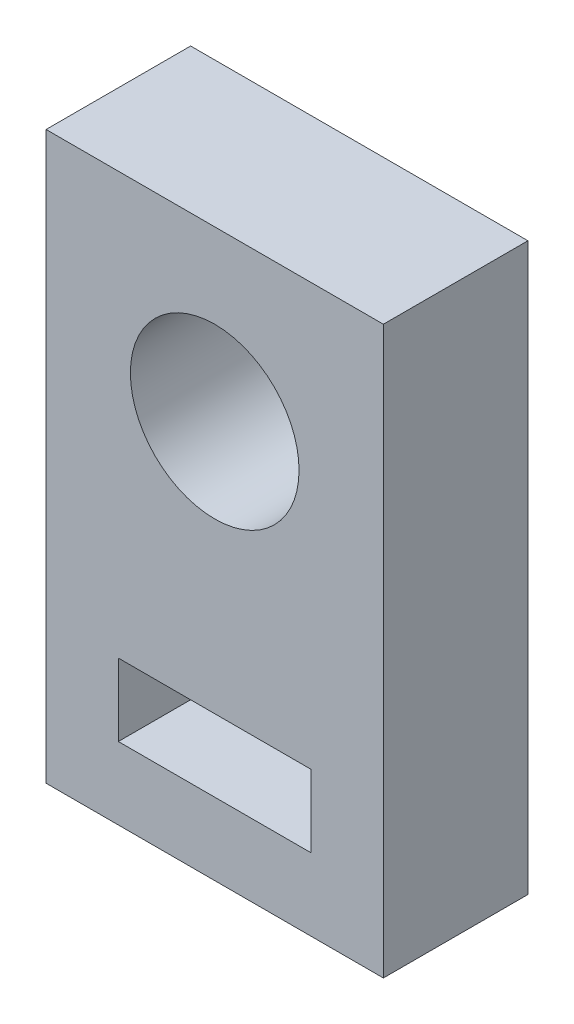
ISO-10303-21;
HEADER;
FILE_DESCRIPTION(('STEP AP214'),'2;1');
FILE_NAME('part.step','',(''),(''),'','','');
FILE_SCHEMA(('AUTOMOTIVE_DESIGN { 1 0 10303 214 1 1 1 1 }'));
ENDSEC;
DATA;
#1=APPLICATION_CONTEXT('core data for automotive mechanical design processes');
#2=APPLICATION_PROTOCOL_DEFINITION('international standard','automotive_design',2000,#1);
#3=PRODUCT_CONTEXT('',#1,'mechanical');
#4=PRODUCT('Part','Part','',(#3));
#5=PRODUCT_RELATED_PRODUCT_CATEGORY('part','',(#4));
#6=PRODUCT_DEFINITION_FORMATION('','',#4);
#7=PRODUCT_DEFINITION_CONTEXT('part definition',#1,'design');
#8=PRODUCT_DEFINITION('design','',#6,#7);
#9=PRODUCT_DEFINITION_SHAPE('','',#8);
#10=(LENGTH_UNIT() NAMED_UNIT(*) SI_UNIT(.MILLI.,.METRE.));
#11=(NAMED_UNIT(*) PLANE_ANGLE_UNIT() SI_UNIT($,.RADIAN.));
#12=(NAMED_UNIT(*) SI_UNIT($,.STERADIAN.) SOLID_ANGLE_UNIT());
#13=UNCERTAINTY_MEASURE_WITH_UNIT(LENGTH_MEASURE(1.E-05),#10,'distance_accuracy_value','');
#14=(GEOMETRIC_REPRESENTATION_CONTEXT(3) GLOBAL_UNCERTAINTY_ASSIGNED_CONTEXT((#13)) GLOBAL_UNIT_ASSIGNED_CONTEXT((#10,
#11,#12)) REPRESENTATION_CONTEXT('',''));
#15=CARTESIAN_POINT('',(0.,0.,0.));
#16=DIRECTION('',(0.,0.,1.));
#17=DIRECTION('',(1.,0.,0.));
#18=AXIS2_PLACEMENT_3D('',#15,#16,#17);
#19=CARTESIAN_POINT('',(0.,-7.96436240136799,6.));
#20=DIRECTION('',(0.,1.,0.));
#21=DIRECTION('',(0.,0.,1.));
#22=AXIS2_PLACEMENT_3D('',#19,#20,#21);
#23=PLANE('',#22);
#24=DIRECTION('',(1.,0.,0.));
#25=VECTOR('',#24,1.);
#26=CARTESIAN_POINT('',(0.,-7.96436240136799,0.));
#27=LINE('',#26,#25);
#28=CARTESIAN_POINT('',(-6.84808447260447,-7.96436240136799,0.));
#29=VERTEX_POINT('',#28);
#30=CARTESIAN_POINT('',(7.15191552739555,-7.96436240136799,0.));
#31=VERTEX_POINT('',#30);
#32=EDGE_CURVE('E146',#29,#31,#27,.T.);
#33=ORIENTED_EDGE('',*,*,#32,.T.);
#34=DIRECTION('',(0.,0.,-1.));
#35=VECTOR('',#34,1.);
#36=CARTESIAN_POINT('',(7.15191552739555,-7.96436240136799,6.));
#37=LINE('',#36,#35);
#38=CARTESIAN_POINT('',(7.15191552739555,-7.96436240136799,6.));
#39=VERTEX_POINT('',#38);
#40=EDGE_CURVE('E11',#39,#31,#37,.T.);
#41=ORIENTED_EDGE('',*,*,#40,.F.);
#42=DIRECTION('',(1.,0.,0.));
#43=VECTOR('',#42,1.);
#44=CARTESIAN_POINT('',(0.,-7.96436240136799,6.));
#45=LINE('',#44,#43);
#46=CARTESIAN_POINT('',(-6.84808447260447,-7.96436240136799,6.));
#47=VERTEX_POINT('',#46);
#48=EDGE_CURVE('E114',#47,#39,#45,.T.);
#49=ORIENTED_EDGE('',*,*,#48,.F.);
#50=DIRECTION('',(0.,0.,-1.));
#51=VECTOR('',#50,1.);
#52=CARTESIAN_POINT('',(-6.84808447260447,-7.96436240136799,6.));
#53=LINE('',#52,#51);
#54=EDGE_CURVE('E54',#47,#29,#53,.T.);
#55=ORIENTED_EDGE('',*,*,#54,.T.);
#56=EDGE_LOOP('',(#33,#41,#49,#55));
#57=FACE_BOUND('',#56,.T.);
#58=ADVANCED_FACE('F35',(#57),#23,.F.);
#59=CARTESIAN_POINT('',(7.15191552739554,0.,6.));
#60=DIRECTION('',(-1.,0.,0.));
#61=DIRECTION('',(0.,-1.,0.));
#62=AXIS2_PLACEMENT_3D('',#59,#60,#61);
#63=PLANE('',#62);
#64=DIRECTION('',(0.,1.,0.));
#65=VECTOR('',#64,1.);
#66=CARTESIAN_POINT('',(7.15191552739554,0.,0.));
#67=LINE('',#66,#65);
#68=CARTESIAN_POINT('',(7.15191552739554,15.535637598632,0.));
#69=VERTEX_POINT('',#68);
#70=EDGE_CURVE('E120',#31,#69,#67,.T.);
#71=ORIENTED_EDGE('',*,*,#70,.T.);
#72=DIRECTION('',(0.,0.,-1.));
#73=VECTOR('',#72,1.);
#74=CARTESIAN_POINT('',(7.15191552739554,15.535637598632,6.));
#75=LINE('',#74,#73);
#76=CARTESIAN_POINT('',(7.15191552739554,15.535637598632,6.));
#77=VERTEX_POINT('',#76);
#78=EDGE_CURVE('E45',#77,#69,#75,.T.);
#79=ORIENTED_EDGE('',*,*,#78,.F.);
#80=DIRECTION('',(0.,1.,0.));
#81=VECTOR('',#80,1.);
#82=CARTESIAN_POINT('',(7.15191552739554,0.,6.));
#83=LINE('',#82,#81);
#84=EDGE_CURVE('E108',#39,#77,#83,.T.);
#85=ORIENTED_EDGE('',*,*,#84,.F.);
#86=ORIENTED_EDGE('',*,*,#40,.T.);
#87=EDGE_LOOP('',(#71,#79,#85,#86));
#88=FACE_BOUND('',#87,.T.);
#89=ADVANCED_FACE('F119',(#88),#63,.F.);
#90=CARTESIAN_POINT('',(0.,15.535637598632,6.));
#91=DIRECTION('',(0.,1.,0.));
#92=DIRECTION('',(-1.,0.,0.));
#93=AXIS2_PLACEMENT_3D('',#90,#91,#92);
#94=PLANE('',#93);
#95=DIRECTION('',(1.,0.,0.));
#96=VECTOR('',#95,1.);
#97=CARTESIAN_POINT('',(0.,15.535637598632,0.));
#98=LINE('',#97,#96);
#99=CARTESIAN_POINT('',(-6.84808447260447,15.535637598632,0.));
#100=VERTEX_POINT('',#99);
#101=EDGE_CURVE('E149',#100,#69,#98,.T.);
#102=ORIENTED_EDGE('',*,*,#101,.F.);
#103=DIRECTION('',(0.,0.,-1.));
#104=VECTOR('',#103,1.);
#105=CARTESIAN_POINT('',(-6.84808447260447,15.535637598632,6.));
#106=LINE('',#105,#104);
#107=CARTESIAN_POINT('',(-6.84808447260447,15.535637598632,6.));
#108=VERTEX_POINT('',#107);
#109=EDGE_CURVE('E80',#108,#100,#106,.T.);
#110=ORIENTED_EDGE('',*,*,#109,.F.);
#111=DIRECTION('',(1.,0.,0.));
#112=VECTOR('',#111,1.);
#113=CARTESIAN_POINT('',(0.,15.535637598632,6.));
#114=LINE('',#113,#112);
#115=EDGE_CURVE('E113',#108,#77,#114,.T.);
#116=ORIENTED_EDGE('',*,*,#115,.T.);
#117=ORIENTED_EDGE('',*,*,#78,.T.);
#118=EDGE_LOOP('',(#102,#110,#116,#117));
#119=FACE_BOUND('',#118,.T.);
#120=ADVANCED_FACE('F124',(#119),#94,.T.);
#121=CARTESIAN_POINT('',(4.15191552739554,0.,6.));
#122=DIRECTION('',(-1.,0.,0.));
#123=DIRECTION('',(0.,-1.,0.));
#124=AXIS2_PLACEMENT_3D('',#121,#122,#123);
#125=PLANE('',#124);
#126=DIRECTION('',(0.,1.,0.));
#127=VECTOR('',#126,1.);
#128=CARTESIAN_POINT('',(4.15191552739554,0.,0.));
#129=LINE('',#128,#127);
#130=CARTESIAN_POINT('',(4.15191552739554,-4.96436240136799,0.));
#131=VERTEX_POINT('',#130);
#132=CARTESIAN_POINT('',(4.15191552739554,-1.96436240136799,0.));
#133=VERTEX_POINT('',#132);
#134=EDGE_CURVE('E134',#131,#133,#129,.T.);
#135=ORIENTED_EDGE('',*,*,#134,.F.);
#136=DIRECTION('',(0.,0.,-1.));
#137=VECTOR('',#136,1.);
#138=CARTESIAN_POINT('',(4.15191552739554,-4.96436240136799,6.));
#139=LINE('',#138,#137);
#140=CARTESIAN_POINT('',(4.15191552739554,-4.96436240136799,6.));
#141=VERTEX_POINT('',#140);
#142=EDGE_CURVE('E39',#141,#131,#139,.T.);
#143=ORIENTED_EDGE('',*,*,#142,.F.);
#144=DIRECTION('',(0.,1.,0.));
#145=VECTOR('',#144,1.);
#146=CARTESIAN_POINT('',(4.15191552739554,0.,6.));
#147=LINE('',#146,#145);
#148=CARTESIAN_POINT('',(4.15191552739554,-1.96436240136799,6.));
#149=VERTEX_POINT('',#148);
#150=EDGE_CURVE('E185',#141,#149,#147,.T.);
#151=ORIENTED_EDGE('',*,*,#150,.T.);
#152=DIRECTION('',(0.,0.,-1.));
#153=VECTOR('',#152,1.);
#154=CARTESIAN_POINT('',(4.15191552739554,-1.96436240136799,6.));
#155=LINE('',#154,#153);
#156=EDGE_CURVE('E127',#149,#133,#155,.T.);
#157=ORIENTED_EDGE('',*,*,#156,.T.);
#158=EDGE_LOOP('',(#135,#143,#151,#157));
#159=FACE_BOUND('',#158,.T.);
#160=ADVANCED_FACE('F170',(#159),#125,.T.);
#161=CARTESIAN_POINT('',(0.,-4.96436240136799,6.));
#162=DIRECTION('',(0.,1.,0.));
#163=DIRECTION('',(-1.,0.,0.));
#164=AXIS2_PLACEMENT_3D('',#161,#162,#163);
#165=PLANE('',#164);
#166=DIRECTION('',(1.,0.,0.));
#167=VECTOR('',#166,1.);
#168=CARTESIAN_POINT('',(0.,-4.96436240136799,0.));
#169=LINE('',#168,#167);
#170=CARTESIAN_POINT('',(-3.84808447260446,-4.96436240136799,0.));
#171=VERTEX_POINT('',#170);
#172=EDGE_CURVE('E137',#171,#131,#169,.T.);
#173=ORIENTED_EDGE('',*,*,#172,.F.);
#174=DIRECTION('',(0.,0.,-1.));
#175=VECTOR('',#174,1.);
#176=CARTESIAN_POINT('',(-3.84808447260446,-4.96436240136799,6.));
#177=LINE('',#176,#175);
#178=CARTESIAN_POINT('',(-3.84808447260446,-4.96436240136799,6.));
#179=VERTEX_POINT('',#178);
#180=EDGE_CURVE('E160',#179,#171,#177,.T.);
#181=ORIENTED_EDGE('',*,*,#180,.F.);
#182=DIRECTION('',(1.,0.,0.));
#183=VECTOR('',#182,1.);
#184=CARTESIAN_POINT('',(0.,-4.96436240136799,6.));
#185=LINE('',#184,#183);
#186=EDGE_CURVE('E169',#179,#141,#185,.T.);
#187=ORIENTED_EDGE('',*,*,#186,.T.);
#188=ORIENTED_EDGE('',*,*,#142,.T.);
#189=EDGE_LOOP('',(#173,#181,#187,#188));
#190=FACE_BOUND('',#189,.T.);
#191=ADVANCED_FACE('F167',(#190),#165,.T.);
#192=CARTESIAN_POINT('',(-3.84808447260446,0.,6.));
#193=DIRECTION('',(-1.,0.,0.));
#194=DIRECTION('',(0.,0.,1.));
#195=AXIS2_PLACEMENT_3D('',#192,#193,#194);
#196=PLANE('',#195);
#197=DIRECTION('',(0.,1.,0.));
#198=VECTOR('',#197,1.);
#199=CARTESIAN_POINT('',(-3.84808447260446,0.,0.));
#200=LINE('',#199,#198);
#201=CARTESIAN_POINT('',(-3.84808447260446,-1.96436240136799,0.));
#202=VERTEX_POINT('',#201);
#203=EDGE_CURVE('E140',#171,#202,#200,.T.);
#204=ORIENTED_EDGE('',*,*,#203,.T.);
#205=DIRECTION('',(0.,0.,-1.));
#206=VECTOR('',#205,1.);
#207=CARTESIAN_POINT('',(-3.84808447260446,-1.96436240136799,6.));
#208=LINE('',#207,#206);
#209=CARTESIAN_POINT('',(-3.84808447260446,-1.96436240136799,6.));
#210=VERTEX_POINT('',#209);
#211=EDGE_CURVE('E158',#210,#202,#208,.T.);
#212=ORIENTED_EDGE('',*,*,#211,.F.);
#213=DIRECTION('',(0.,1.,0.));
#214=VECTOR('',#213,1.);
#215=CARTESIAN_POINT('',(-3.84808447260446,0.,6.));
#216=LINE('',#215,#214);
#217=EDGE_CURVE('E178',#179,#210,#216,.T.);
#218=ORIENTED_EDGE('',*,*,#217,.F.);
#219=ORIENTED_EDGE('',*,*,#180,.T.);
#220=EDGE_LOOP('',(#204,#212,#218,#219));
#221=FACE_BOUND('',#220,.T.);
#222=ADVANCED_FACE('F176',(#221),#196,.F.);
#223=CARTESIAN_POINT('',(0.,-1.96436240136799,6.));
#224=DIRECTION('',(0.,1.,0.));
#225=DIRECTION('',(-1.,0.,0.));
#226=AXIS2_PLACEMENT_3D('',#223,#224,#225);
#227=PLANE('',#226);
#228=DIRECTION('',(1.,0.,0.));
#229=VECTOR('',#228,1.);
#230=CARTESIAN_POINT('',(0.,-1.96436240136799,0.));
#231=LINE('',#230,#229);
#232=EDGE_CURVE('E143',#202,#133,#231,.T.);
#233=ORIENTED_EDGE('',*,*,#232,.T.);
#234=ORIENTED_EDGE('',*,*,#156,.F.);
#235=DIRECTION('',(1.,0.,0.));
#236=VECTOR('',#235,1.);
#237=CARTESIAN_POINT('',(0.,-1.96436240136799,6.));
#238=LINE('',#237,#236);
#239=EDGE_CURVE('E181',#210,#149,#238,.T.);
#240=ORIENTED_EDGE('',*,*,#239,.F.);
#241=ORIENTED_EDGE('',*,*,#211,.T.);
#242=EDGE_LOOP('',(#233,#234,#240,#241));
#243=FACE_BOUND('',#242,.T.);
#244=ADVANCED_FACE('F180',(#243),#227,.F.);
#245=CARTESIAN_POINT('',(0.151915527395555,8.53563759863201,6.));
#246=DIRECTION('',(0.,0.,-1.));
#247=DIRECTION('',(-1.,0.,0.));
#248=AXIS2_PLACEMENT_3D('',#245,#246,#247);
#249=CYLINDRICAL_SURFACE('',#248,3.5);
#250=CARTESIAN_POINT('',(0.151915527395555,8.53563759863201,6.));
#251=DIRECTION('',(0.,0.,1.));
#252=DIRECTION('',(1.,0.,0.));
#253=AXIS2_PLACEMENT_3D('',#250,#251,#252);
#254=CIRCLE('',#253,3.5);
#255=CARTESIAN_POINT('',(3.65191552739555,8.53563759863201,6.));
#256=VERTEX_POINT('',#255);
#257=EDGE_CURVE('E154',#256,#256,#254,.T.);
#258=ORIENTED_EDGE('',*,*,#257,.T.);
#259=EDGE_LOOP('',(#258));
#260=FACE_BOUND('',#259,.T.);
#261=CARTESIAN_POINT('',(0.151915527395555,8.53563759863201,0.));
#262=DIRECTION('',(0.,0.,1.));
#263=DIRECTION('',(1.,0.,0.));
#264=AXIS2_PLACEMENT_3D('',#261,#262,#263);
#265=CIRCLE('',#264,3.5);
#266=CARTESIAN_POINT('',(3.65191552739555,8.53563759863201,0.));
#267=VERTEX_POINT('',#266);
#268=EDGE_CURVE('E131',#267,#267,#265,.T.);
#269=ORIENTED_EDGE('',*,*,#268,.F.);
#270=EDGE_LOOP('',(#269));
#271=FACE_BOUND('',#270,.T.);
#272=ADVANCED_FACE('F37',(#260,#271),#249,.F.);
#273=CARTESIAN_POINT('',(-6.84808447260447,0.,6.));
#274=DIRECTION('',(-1.,0.,0.));
#275=DIRECTION('',(0.,0.,1.));
#276=AXIS2_PLACEMENT_3D('',#273,#274,#275);
#277=PLANE('',#276);
#278=DIRECTION('',(0.,1.,0.));
#279=VECTOR('',#278,1.);
#280=CARTESIAN_POINT('',(-6.84808447260447,0.,0.));
#281=LINE('',#280,#279);
#282=EDGE_CURVE('E151',#29,#100,#281,.T.);
#283=ORIENTED_EDGE('',*,*,#282,.F.);
#284=ORIENTED_EDGE('',*,*,#54,.F.);
#285=DIRECTION('',(0.,1.,0.));
#286=VECTOR('',#285,1.);
#287=CARTESIAN_POINT('',(-6.84808447260447,0.,6.));
#288=LINE('',#287,#286);
#289=EDGE_CURVE('E125',#47,#108,#288,.T.);
#290=ORIENTED_EDGE('',*,*,#289,.T.);
#291=ORIENTED_EDGE('',*,*,#109,.T.);
#292=EDGE_LOOP('',(#283,#284,#290,#291));
#293=FACE_BOUND('',#292,.T.);
#294=ADVANCED_FACE('F195',(#293),#277,.T.);
#295=CARTESIAN_POINT('',(0.,0.,6.));
#296=DIRECTION('',(0.,0.,1.));
#297=DIRECTION('',(1.,0.,0.));
#298=AXIS2_PLACEMENT_3D('',#295,#296,#297);
#299=PLANE('',#298);
#300=ORIENTED_EDGE('',*,*,#257,.F.);
#301=EDGE_LOOP('',(#300));
#302=FACE_BOUND('',#301,.T.);
#303=ORIENTED_EDGE('',*,*,#150,.F.);
#304=ORIENTED_EDGE('',*,*,#186,.F.);
#305=ORIENTED_EDGE('',*,*,#217,.T.);
#306=ORIENTED_EDGE('',*,*,#239,.T.);
#307=EDGE_LOOP('',(#303,#304,#305,#306));
#308=FACE_BOUND('',#307,.T.);
#309=ORIENTED_EDGE('',*,*,#48,.T.);
#310=ORIENTED_EDGE('',*,*,#84,.T.);
#311=ORIENTED_EDGE('',*,*,#115,.F.);
#312=ORIENTED_EDGE('',*,*,#289,.F.);
#313=EDGE_LOOP('',(#309,#310,#311,#312));
#314=FACE_BOUND('',#313,.T.);
#315=ADVANCED_FACE('F110',(#302,#308,#314),#299,.T.);
#316=CARTESIAN_POINT('',(0.,0.,0.));
#317=DIRECTION('',(0.,0.,1.));
#318=DIRECTION('',(1.,0.,0.));
#319=AXIS2_PLACEMENT_3D('',#316,#317,#318);
#320=PLANE('',#319);
#321=ORIENTED_EDGE('',*,*,#268,.T.);
#322=EDGE_LOOP('',(#321));
#323=FACE_BOUND('',#322,.T.);
#324=ORIENTED_EDGE('',*,*,#134,.T.);
#325=ORIENTED_EDGE('',*,*,#232,.F.);
#326=ORIENTED_EDGE('',*,*,#203,.F.);
#327=ORIENTED_EDGE('',*,*,#172,.T.);
#328=EDGE_LOOP('',(#324,#325,#326,#327));
#329=FACE_BOUND('',#328,.T.);
#330=ORIENTED_EDGE('',*,*,#32,.F.);
#331=ORIENTED_EDGE('',*,*,#282,.T.);
#332=ORIENTED_EDGE('',*,*,#101,.T.);
#333=ORIENTED_EDGE('',*,*,#70,.F.);
#334=EDGE_LOOP('',(#330,#331,#332,#333));
#335=FACE_BOUND('',#334,.T.);
#336=ADVANCED_FACE('F173',(#323,#329,#335),#320,.F.);
#337=CLOSED_SHELL('',(#58,#89,#120,#160,#191,#222,#244,#272,#294,#315,#336));
#338=MANIFOLD_SOLID_BREP('B2',#337);
#339=ADVANCED_BREP_SHAPE_REPRESENTATION('',(#18,#338),#14);
#340=SHAPE_DEFINITION_REPRESENTATION(#9,#339);
ENDSEC;
END-ISO-10303-21;
